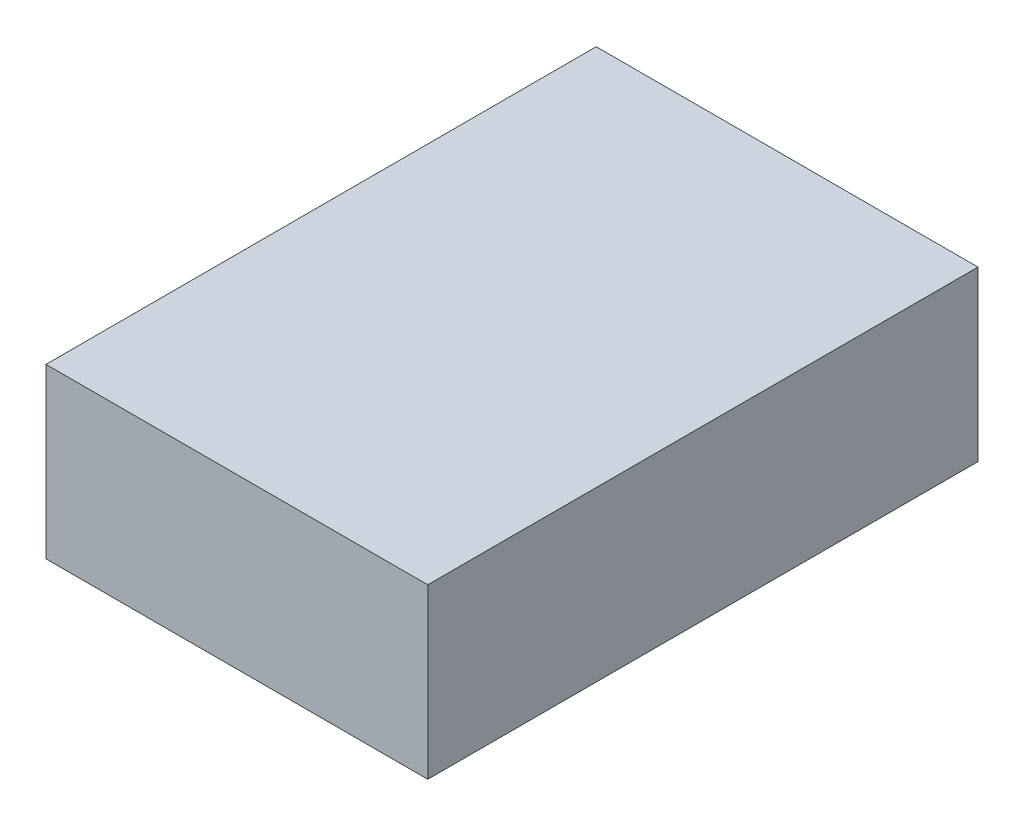
ISO-10303-21;
HEADER;
FILE_DESCRIPTION(('STEP AP214'),'2;1');
FILE_NAME('part.step','',(''),(''),'','','');
FILE_SCHEMA(('AUTOMOTIVE_DESIGN { 1 0 10303 214 1 1 1 1 }'));
ENDSEC;
DATA;
#1=APPLICATION_CONTEXT('core data for automotive mechanical design processes');
#2=APPLICATION_PROTOCOL_DEFINITION('international standard','automotive_design',2000,#1);
#3=PRODUCT_CONTEXT('',#1,'mechanical');
#4=PRODUCT('Part','Part','',(#3));
#5=PRODUCT_RELATED_PRODUCT_CATEGORY('part','',(#4));
#6=PRODUCT_DEFINITION_FORMATION('','',#4);
#7=PRODUCT_DEFINITION_CONTEXT('part definition',#1,'design');
#8=PRODUCT_DEFINITION('design','',#6,#7);
#9=PRODUCT_DEFINITION_SHAPE('','',#8);
#10=(LENGTH_UNIT() NAMED_UNIT(*) SI_UNIT(.MILLI.,.METRE.));
#11=(NAMED_UNIT(*) PLANE_ANGLE_UNIT() SI_UNIT($,.RADIAN.));
#12=(NAMED_UNIT(*) SI_UNIT($,.STERADIAN.) SOLID_ANGLE_UNIT());
#13=UNCERTAINTY_MEASURE_WITH_UNIT(LENGTH_MEASURE(1.E-05),#10,'distance_accuracy_value','');
#14=(GEOMETRIC_REPRESENTATION_CONTEXT(3) GLOBAL_UNCERTAINTY_ASSIGNED_CONTEXT((#13)) GLOBAL_UNIT_ASSIGNED_CONTEXT((#10,
#11,#12)) REPRESENTATION_CONTEXT('',''));
#15=CARTESIAN_POINT('',(0.,0.,0.));
#16=DIRECTION('',(0.,0.,1.));
#17=DIRECTION('',(1.,0.,0.));
#18=AXIS2_PLACEMENT_3D('',#15,#16,#17);
#19=CARTESIAN_POINT('',(0.,0.,24.5));
#20=DIRECTION('',(1.,0.,0.));
#21=DIRECTION('',(0.,0.,-1.));
#22=AXIS2_PLACEMENT_3D('',#19,#20,#21);
#23=PLANE('',#22);
#24=DIRECTION('',(0.,-1.,0.));
#25=VECTOR('',#24,1.);
#26=CARTESIAN_POINT('',(0.,0.,0.));
#27=LINE('',#26,#25);
#28=CARTESIAN_POINT('',(0.,7.5,0.));
#29=VERTEX_POINT('',#28);
#30=CARTESIAN_POINT('',(0.,0.,0.));
#31=VERTEX_POINT('',#30);
#32=EDGE_CURVE('E108',#29,#31,#27,.T.);
#33=ORIENTED_EDGE('',*,*,#32,.T.);
#34=DIRECTION('',(0.,0.,-1.));
#35=VECTOR('',#34,1.);
#36=CARTESIAN_POINT('',(0.,0.,24.5));
#37=LINE('',#36,#35);
#38=CARTESIAN_POINT('',(0.,0.,24.5));
#39=VERTEX_POINT('',#38);
#40=EDGE_CURVE('E11',#39,#31,#37,.T.);
#41=ORIENTED_EDGE('',*,*,#40,.F.);
#42=DIRECTION('',(0.,-1.,0.));
#43=VECTOR('',#42,1.);
#44=CARTESIAN_POINT('',(0.,0.,24.5));
#45=LINE('',#44,#43);
#46=CARTESIAN_POINT('',(0.,7.5,24.5));
#47=VERTEX_POINT('',#46);
#48=EDGE_CURVE('E96',#47,#39,#45,.T.);
#49=ORIENTED_EDGE('',*,*,#48,.F.);
#50=DIRECTION('',(0.,0.,-1.));
#51=VECTOR('',#50,1.);
#52=CARTESIAN_POINT('',(0.,7.5,24.5));
#53=LINE('',#52,#51);
#54=EDGE_CURVE('E104',#47,#29,#53,.T.);
#55=ORIENTED_EDGE('',*,*,#54,.T.);
#56=EDGE_LOOP('',(#33,#41,#49,#55));
#57=FACE_BOUND('',#56,.T.);
#58=ADVANCED_FACE('F45',(#57),#23,.F.);
#59=CARTESIAN_POINT('',(0.,0.,24.5));
#60=DIRECTION('',(0.,1.,0.));
#61=DIRECTION('',(0.,0.,1.));
#62=AXIS2_PLACEMENT_3D('',#59,#60,#61);
#63=PLANE('',#62);
#64=DIRECTION('',(1.,0.,0.));
#65=VECTOR('',#64,1.);
#66=CARTESIAN_POINT('',(0.,0.,0.));
#67=LINE('',#66,#65);
#68=CARTESIAN_POINT('',(16.9982698961938,0.,0.));
#69=VERTEX_POINT('',#68);
#70=EDGE_CURVE('E100',#31,#69,#67,.T.);
#71=ORIENTED_EDGE('',*,*,#70,.T.);
#72=DIRECTION('',(0.,0.,-1.));
#73=VECTOR('',#72,1.);
#74=CARTESIAN_POINT('',(16.9982698961938,0.,24.5));
#75=LINE('',#74,#73);
#76=CARTESIAN_POINT('',(16.9982698961938,0.,24.5));
#77=VERTEX_POINT('',#76);
#78=EDGE_CURVE('E53',#77,#69,#75,.T.);
#79=ORIENTED_EDGE('',*,*,#78,.F.);
#80=DIRECTION('',(1.,0.,0.));
#81=VECTOR('',#80,1.);
#82=CARTESIAN_POINT('',(0.,0.,24.5));
#83=LINE('',#82,#81);
#84=EDGE_CURVE('E91',#39,#77,#83,.T.);
#85=ORIENTED_EDGE('',*,*,#84,.F.);
#86=ORIENTED_EDGE('',*,*,#40,.T.);
#87=EDGE_LOOP('',(#71,#79,#85,#86));
#88=FACE_BOUND('',#87,.T.);
#89=ADVANCED_FACE('F99',(#88),#63,.F.);
#90=CARTESIAN_POINT('',(16.9982698961938,0.,24.5));
#91=DIRECTION('',(-1.,0.,0.));
#92=DIRECTION('',(0.,0.,1.));
#93=AXIS2_PLACEMENT_3D('',#90,#91,#92);
#94=PLANE('',#93);
#95=DIRECTION('',(0.,1.,0.));
#96=VECTOR('',#95,1.);
#97=CARTESIAN_POINT('',(16.9982698961938,0.,0.));
#98=LINE('',#97,#96);
#99=CARTESIAN_POINT('',(16.9982698961938,7.5,0.));
#100=VERTEX_POINT('',#99);
#101=EDGE_CURVE('E78',#69,#100,#98,.T.);
#102=ORIENTED_EDGE('',*,*,#101,.T.);
#103=DIRECTION('',(0.,0.,-1.));
#104=VECTOR('',#103,1.);
#105=CARTESIAN_POINT('',(16.9982698961938,7.5,24.5));
#106=LINE('',#105,#104);
#107=CARTESIAN_POINT('',(16.9982698961938,7.5,24.5));
#108=VERTEX_POINT('',#107);
#109=EDGE_CURVE('E101',#108,#100,#106,.T.);
#110=ORIENTED_EDGE('',*,*,#109,.F.);
#111=DIRECTION('',(0.,1.,0.));
#112=VECTOR('',#111,1.);
#113=CARTESIAN_POINT('',(16.9982698961938,0.,24.5));
#114=LINE('',#113,#112);
#115=EDGE_CURVE('E94',#77,#108,#114,.T.);
#116=ORIENTED_EDGE('',*,*,#115,.F.);
#117=ORIENTED_EDGE('',*,*,#78,.T.);
#118=EDGE_LOOP('',(#102,#110,#116,#117));
#119=FACE_BOUND('',#118,.T.);
#120=ADVANCED_FACE('F102',(#119),#94,.F.);
#121=CARTESIAN_POINT('',(0.,7.5,24.5));
#122=DIRECTION('',(0.,-1.,0.));
#123=DIRECTION('',(0.,0.,-1.));
#124=AXIS2_PLACEMENT_3D('',#121,#122,#123);
#125=PLANE('',#124);
#126=DIRECTION('',(-1.,0.,0.));
#127=VECTOR('',#126,1.);
#128=CARTESIAN_POINT('',(0.,7.5,0.));
#129=LINE('',#128,#127);
#130=EDGE_CURVE('E84',#100,#29,#129,.T.);
#131=ORIENTED_EDGE('',*,*,#130,.T.);
#132=ORIENTED_EDGE('',*,*,#54,.F.);
#133=DIRECTION('',(-1.,0.,0.));
#134=VECTOR('',#133,1.);
#135=CARTESIAN_POINT('',(0.,7.5,24.5));
#136=LINE('',#135,#134);
#137=EDGE_CURVE('E61',#108,#47,#136,.T.);
#138=ORIENTED_EDGE('',*,*,#137,.F.);
#139=ORIENTED_EDGE('',*,*,#109,.T.);
#140=EDGE_LOOP('',(#131,#132,#138,#139));
#141=FACE_BOUND('',#140,.T.);
#142=ADVANCED_FACE('F115',(#141),#125,.F.);
#143=CARTESIAN_POINT('',(0.,0.,24.5));
#144=DIRECTION('',(0.,0.,-1.));
#145=DIRECTION('',(-1.,0.,0.));
#146=AXIS2_PLACEMENT_3D('',#143,#144,#145);
#147=PLANE('',#146);
#148=ORIENTED_EDGE('',*,*,#48,.T.);
#149=ORIENTED_EDGE('',*,*,#84,.T.);
#150=ORIENTED_EDGE('',*,*,#115,.T.);
#151=ORIENTED_EDGE('',*,*,#137,.T.);
#152=EDGE_LOOP('',(#148,#149,#150,#151));
#153=FACE_BOUND('',#152,.T.);
#154=ADVANCED_FACE('F92',(#153),#147,.F.);
#155=CARTESIAN_POINT('',(0.,0.,0.));
#156=DIRECTION('',(0.,0.,-1.));
#157=DIRECTION('',(-1.,0.,0.));
#158=AXIS2_PLACEMENT_3D('',#155,#156,#157);
#159=PLANE('',#158);
#160=ORIENTED_EDGE('',*,*,#32,.F.);
#161=ORIENTED_EDGE('',*,*,#130,.F.);
#162=ORIENTED_EDGE('',*,*,#101,.F.);
#163=ORIENTED_EDGE('',*,*,#70,.F.);
#164=EDGE_LOOP('',(#160,#161,#162,#163));
#165=FACE_BOUND('',#164,.T.);
#166=ADVANCED_FACE('F118',(#165),#159,.T.);
#167=CLOSED_SHELL('',(#58,#89,#120,#142,#154,#166));
#168=MANIFOLD_SOLID_BREP('B2',#167);
#169=ADVANCED_BREP_SHAPE_REPRESENTATION('',(#18,#168),#14);
#170=SHAPE_DEFINITION_REPRESENTATION(#9,#169);
ENDSEC;
END-ISO-10303-21;
